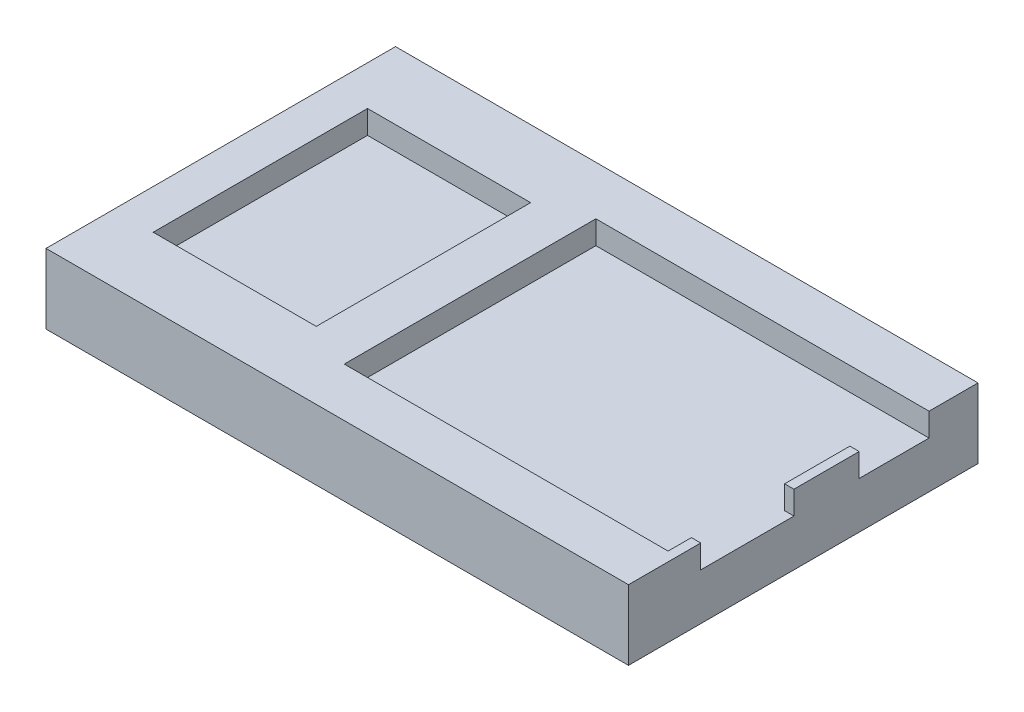
ISO-10303-21;
HEADER;
FILE_DESCRIPTION(('STEP AP214'),'2;1');
FILE_NAME('part.step','',(''),(''),'','','');
FILE_SCHEMA(('AUTOMOTIVE_DESIGN { 1 0 10303 214 1 1 1 1 }'));
ENDSEC;
DATA;
#1=APPLICATION_CONTEXT('core data for automotive mechanical design processes');
#2=APPLICATION_PROTOCOL_DEFINITION('international standard','automotive_design',2000,#1);
#3=PRODUCT_CONTEXT('',#1,'mechanical');
#4=PRODUCT('Part','Part','',(#3));
#5=PRODUCT_RELATED_PRODUCT_CATEGORY('part','',(#4));
#6=PRODUCT_DEFINITION_FORMATION('','',#4);
#7=PRODUCT_DEFINITION_CONTEXT('part definition',#1,'design');
#8=PRODUCT_DEFINITION('design','',#6,#7);
#9=PRODUCT_DEFINITION_SHAPE('','',#8);
#10=(LENGTH_UNIT() NAMED_UNIT(*) SI_UNIT(.MILLI.,.METRE.));
#11=(NAMED_UNIT(*) PLANE_ANGLE_UNIT() SI_UNIT($,.RADIAN.));
#12=(NAMED_UNIT(*) SI_UNIT($,.STERADIAN.) SOLID_ANGLE_UNIT());
#13=UNCERTAINTY_MEASURE_WITH_UNIT(LENGTH_MEASURE(1.E-05),#10,'distance_accuracy_value','');
#14=(GEOMETRIC_REPRESENTATION_CONTEXT(3) GLOBAL_UNCERTAINTY_ASSIGNED_CONTEXT((#13)) GLOBAL_UNIT_ASSIGNED_CONTEXT((#10,
#11,#12)) REPRESENTATION_CONTEXT('',''));
#15=CARTESIAN_POINT('',(0.,0.,0.));
#16=DIRECTION('',(0.,0.,1.));
#17=DIRECTION('',(1.,0.,0.));
#18=AXIS2_PLACEMENT_3D('',#15,#16,#17);
#19=CARTESIAN_POINT('',(0.,15.,0.));
#20=DIRECTION('',(0.,-1.,0.));
#21=DIRECTION('',(0.,0.,-1.));
#22=AXIS2_PLACEMENT_3D('',#19,#20,#21);
#23=PLANE('',#22);
#24=DIRECTION('',(0.,0.,-1.));
#25=VECTOR('',#24,1.);
#26=CARTESIAN_POINT('',(125.,15.,0.));
#27=LINE('',#26,#25);
#28=CARTESIAN_POINT('',(125.,15.,-35.5));
#29=VERTEX_POINT('',#28);
#30=CARTESIAN_POINT('',(125.,15.,-49.5));
#31=VERTEX_POINT('',#30);
#32=EDGE_CURVE('E465',#29,#31,#27,.T.);
#33=ORIENTED_EDGE('',*,*,#32,.T.);
#34=DIRECTION('',(1.,0.,0.));
#35=VECTOR('',#34,1.);
#36=CARTESIAN_POINT('',(125.,15.,-49.5));
#37=LINE('',#36,#35);
#38=CARTESIAN_POINT('',(123.,15.,-49.5));
#39=VERTEX_POINT('',#38);
#40=EDGE_CURVE('E370',#39,#31,#37,.T.);
#41=ORIENTED_EDGE('',*,*,#40,.F.);
#42=DIRECTION('',(0.,0.,-1.));
#43=VECTOR('',#42,1.);
#44=CARTESIAN_POINT('',(123.,15.,-49.5));
#45=LINE('',#44,#43);
#46=CARTESIAN_POINT('',(123.,15.,-35.5));
#47=VERTEX_POINT('',#46);
#48=EDGE_CURVE('E366',#47,#39,#45,.T.);
#49=ORIENTED_EDGE('',*,*,#48,.F.);
#50=DIRECTION('',(-1.,0.,0.));
#51=VECTOR('',#50,1.);
#52=CARTESIAN_POINT('',(125.,15.,-35.5));
#53=LINE('',#52,#51);
#54=EDGE_CURVE('E362',#29,#47,#53,.T.);
#55=ORIENTED_EDGE('',*,*,#54,.F.);
#56=EDGE_LOOP('',(#33,#41,#49,#55));
#57=FACE_BOUND('',#56,.T.);
#58=ADVANCED_FACE('F39',(#57),#23,.F.);
#59=CARTESIAN_POINT('',(0.,15.,0.));
#60=DIRECTION('',(1.,0.,0.));
#61=DIRECTION('',(0.,0.,-1.));
#62=AXIS2_PLACEMENT_3D('',#59,#60,#61);
#63=PLANE('',#62);
#64=DIRECTION('',(0.,0.,1.));
#65=VECTOR('',#64,1.);
#66=CARTESIAN_POINT('',(0.,0.,0.));
#67=LINE('',#66,#65);
#68=CARTESIAN_POINT('',(0.,0.,-75.));
#69=VERTEX_POINT('',#68);
#70=CARTESIAN_POINT('',(0.,0.,0.));
#71=VERTEX_POINT('',#70);
#72=EDGE_CURVE('E379',#69,#71,#67,.T.);
#73=ORIENTED_EDGE('',*,*,#72,.T.);
#74=DIRECTION('',(0.,-1.,0.));
#75=VECTOR('',#74,1.);
#76=CARTESIAN_POINT('',(0.,15.,0.));
#77=LINE('',#76,#75);
#78=CARTESIAN_POINT('',(0.,15.,0.));
#79=VERTEX_POINT('',#78);
#80=EDGE_CURVE('E11',#79,#71,#77,.T.);
#81=ORIENTED_EDGE('',*,*,#80,.F.);
#82=DIRECTION('',(0.,0.,1.));
#83=VECTOR('',#82,1.);
#84=CARTESIAN_POINT('',(0.,15.,0.));
#85=LINE('',#84,#83);
#86=CARTESIAN_POINT('',(0.,15.,-75.));
#87=VERTEX_POINT('',#86);
#88=EDGE_CURVE('E451',#87,#79,#85,.T.);
#89=ORIENTED_EDGE('',*,*,#88,.F.);
#90=DIRECTION('',(0.,-1.,0.));
#91=VECTOR('',#90,1.);
#92=CARTESIAN_POINT('',(0.,15.,-75.));
#93=LINE('',#92,#91);
#94=EDGE_CURVE('E468',#87,#69,#93,.T.);
#95=ORIENTED_EDGE('',*,*,#94,.T.);
#96=EDGE_LOOP('',(#73,#81,#89,#95));
#97=FACE_BOUND('',#96,.T.);
#98=ADVANCED_FACE('F41',(#97),#63,.F.);
#99=CARTESIAN_POINT('',(0.,15.,0.));
#100=DIRECTION('',(0.,0.,-1.));
#101=DIRECTION('',(-1.,0.,0.));
#102=AXIS2_PLACEMENT_3D('',#99,#100,#101);
#103=PLANE('',#102);
#104=DIRECTION('',(1.,0.,0.));
#105=VECTOR('',#104,1.);
#106=CARTESIAN_POINT('',(0.,0.,0.));
#107=LINE('',#106,#105);
#108=CARTESIAN_POINT('',(125.,0.,0.));
#109=VERTEX_POINT('',#108);
#110=EDGE_CURVE('E472',#71,#109,#107,.T.);
#111=ORIENTED_EDGE('',*,*,#110,.T.);
#112=DIRECTION('',(0.,-1.,0.));
#113=VECTOR('',#112,1.);
#114=CARTESIAN_POINT('',(125.,15.,0.));
#115=LINE('',#114,#113);
#116=CARTESIAN_POINT('',(125.,15.,0.));
#117=VERTEX_POINT('',#116);
#118=EDGE_CURVE('E48',#117,#109,#115,.T.);
#119=ORIENTED_EDGE('',*,*,#118,.F.);
#120=DIRECTION('',(1.,0.,0.));
#121=VECTOR('',#120,1.);
#122=CARTESIAN_POINT('',(0.,15.,0.));
#123=LINE('',#122,#121);
#124=EDGE_CURVE('E455',#79,#117,#123,.T.);
#125=ORIENTED_EDGE('',*,*,#124,.F.);
#126=ORIENTED_EDGE('',*,*,#80,.T.);
#127=EDGE_LOOP('',(#111,#119,#125,#126));
#128=FACE_BOUND('',#127,.T.);
#129=ADVANCED_FACE('F566',(#128),#103,.F.);
#130=CARTESIAN_POINT('',(125.,15.,0.));
#131=DIRECTION('',(-1.,0.,0.));
#132=DIRECTION('',(0.,0.,1.));
#133=AXIS2_PLACEMENT_3D('',#130,#131,#132);
#134=PLANE('',#133);
#135=ORIENTED_EDGE('',*,*,#32,.F.);
#136=DIRECTION('',(0.,1.,0.));
#137=VECTOR('',#136,1.);
#138=CARTESIAN_POINT('',(125.,10.,-35.5));
#139=LINE('',#138,#137);
#140=CARTESIAN_POINT('',(125.,10.,-35.5));
#141=VERTEX_POINT('',#140);
#142=EDGE_CURVE('E393',#141,#29,#139,.T.);
#143=ORIENTED_EDGE('',*,*,#142,.F.);
#144=DIRECTION('',(0.,0.,-1.));
#145=VECTOR('',#144,1.);
#146=CARTESIAN_POINT('',(125.,10.,-15.5));
#147=LINE('',#146,#145);
#148=CARTESIAN_POINT('',(125.,10.,-15.5));
#149=VERTEX_POINT('',#148);
#150=EDGE_CURVE('E323',#149,#141,#147,.T.);
#151=ORIENTED_EDGE('',*,*,#150,.F.);
#152=DIRECTION('',(0.,1.,0.));
#153=VECTOR('',#152,1.);
#154=CARTESIAN_POINT('',(125.,10.,-15.5));
#155=LINE('',#154,#153);
#156=CARTESIAN_POINT('',(125.,15.,-15.5));
#157=VERTEX_POINT('',#156);
#158=EDGE_CURVE('E396',#149,#157,#155,.T.);
#159=ORIENTED_EDGE('',*,*,#158,.T.);
#160=EDGE_CURVE('E460',#117,#157,#27,.T.);
#161=ORIENTED_EDGE('',*,*,#160,.F.);
#162=ORIENTED_EDGE('',*,*,#118,.T.);
#163=DIRECTION('',(0.,0.,-1.));
#164=VECTOR('',#163,1.);
#165=CARTESIAN_POINT('',(125.,0.,0.));
#166=LINE('',#165,#164);
#167=CARTESIAN_POINT('',(125.,0.,-75.));
#168=VERTEX_POINT('',#167);
#169=EDGE_CURVE('E475',#109,#168,#166,.T.);
#170=ORIENTED_EDGE('',*,*,#169,.T.);
#171=DIRECTION('',(0.,-1.,0.));
#172=VECTOR('',#171,1.);
#173=CARTESIAN_POINT('',(125.,15.,-75.));
#174=LINE('',#173,#172);
#175=CARTESIAN_POINT('',(125.,15.,-75.));
#176=VERTEX_POINT('',#175);
#177=EDGE_CURVE('E483',#176,#168,#174,.T.);
#178=ORIENTED_EDGE('',*,*,#177,.F.);
#179=CARTESIAN_POINT('',(125.,15.,-64.5));
#180=VERTEX_POINT('',#179);
#181=EDGE_CURVE('E459',#180,#176,#27,.T.);
#182=ORIENTED_EDGE('',*,*,#181,.F.);
#183=DIRECTION('',(0.,1.,0.));
#184=VECTOR('',#183,1.);
#185=CARTESIAN_POINT('',(125.,10.,-64.5));
#186=LINE('',#185,#184);
#187=CARTESIAN_POINT('',(125.,10.,-64.5));
#188=VERTEX_POINT('',#187);
#189=EDGE_CURVE('E380',#188,#180,#186,.T.);
#190=ORIENTED_EDGE('',*,*,#189,.F.);
#191=DIRECTION('',(0.,0.,-1.));
#192=VECTOR('',#191,1.);
#193=CARTESIAN_POINT('',(125.,10.,-64.5));
#194=LINE('',#193,#192);
#195=CARTESIAN_POINT('',(125.,10.,-49.5));
#196=VERTEX_POINT('',#195);
#197=EDGE_CURVE('E339',#196,#188,#194,.T.);
#198=ORIENTED_EDGE('',*,*,#197,.F.);
#199=DIRECTION('',(0.,1.,0.));
#200=VECTOR('',#199,1.);
#201=CARTESIAN_POINT('',(125.,10.,-49.5));
#202=LINE('',#201,#200);
#203=EDGE_CURVE('E383',#196,#31,#202,.T.);
#204=ORIENTED_EDGE('',*,*,#203,.T.);
#205=EDGE_LOOP('',(#135,#143,#151,#159,#161,#162,#170,#178,#182,#190,#198,#204));
#206=FACE_BOUND('',#205,.T.);
#207=ADVANCED_FACE('F493',(#206),#134,.F.);
#208=CARTESIAN_POINT('',(0.,15.,-75.));
#209=DIRECTION('',(0.,0.,1.));
#210=DIRECTION('',(1.,0.,0.));
#211=AXIS2_PLACEMENT_3D('',#208,#209,#210);
#212=PLANE('',#211);
#213=DIRECTION('',(-1.,0.,0.));
#214=VECTOR('',#213,1.);
#215=CARTESIAN_POINT('',(0.,0.,-75.));
#216=LINE('',#215,#214);
#217=EDGE_CURVE('E456',#168,#69,#216,.T.);
#218=ORIENTED_EDGE('',*,*,#217,.T.);
#219=ORIENTED_EDGE('',*,*,#94,.F.);
#220=DIRECTION('',(-1.,0.,0.));
#221=VECTOR('',#220,1.);
#222=CARTESIAN_POINT('',(0.,15.,-75.));
#223=LINE('',#222,#221);
#224=EDGE_CURVE('E464',#176,#87,#223,.T.);
#225=ORIENTED_EDGE('',*,*,#224,.F.);
#226=ORIENTED_EDGE('',*,*,#177,.T.);
#227=EDGE_LOOP('',(#218,#219,#225,#226));
#228=FACE_BOUND('',#227,.T.);
#229=ADVANCED_FACE('F502',(#228),#212,.F.);
#230=DIRECTION('',(1.,0.,0.));
#231=VECTOR('',#230,1.);
#232=CARTESIAN_POINT('',(8.49999999999997,15.,-14.5));
#233=LINE('',#232,#231);
#234=CARTESIAN_POINT('',(8.49999999999997,15.,-14.5));
#235=VERTEX_POINT('',#234);
#236=CARTESIAN_POINT('',(43.5,15.,-14.5));
#237=VERTEX_POINT('',#236);
#238=EDGE_CURVE('E429',#235,#237,#233,.T.);
#239=ORIENTED_EDGE('',*,*,#238,.F.);
#240=DIRECTION('',(0.,0.,1.));
#241=VECTOR('',#240,1.);
#242=CARTESIAN_POINT('',(8.49999999999997,15.,-60.5));
#243=LINE('',#242,#241);
#244=CARTESIAN_POINT('',(8.49999999999997,15.,-60.5));
#245=VERTEX_POINT('',#244);
#246=EDGE_CURVE('E259',#245,#235,#243,.T.);
#247=ORIENTED_EDGE('',*,*,#246,.F.);
#248=DIRECTION('',(-1.,0.,0.));
#249=VECTOR('',#248,1.);
#250=CARTESIAN_POINT('',(8.49999999999997,15.,-60.5));
#251=LINE('',#250,#249);
#252=CARTESIAN_POINT('',(43.5,15.,-60.5));
#253=VERTEX_POINT('',#252);
#254=EDGE_CURVE('E414',#253,#245,#251,.T.);
#255=ORIENTED_EDGE('',*,*,#254,.F.);
#256=DIRECTION('',(0.,0.,-1.));
#257=VECTOR('',#256,1.);
#258=CARTESIAN_POINT('',(43.5,15.,-60.5));
#259=LINE('',#258,#257);
#260=EDGE_CURVE('E433',#237,#253,#259,.T.);
#261=ORIENTED_EDGE('',*,*,#260,.F.);
#262=EDGE_LOOP('',(#239,#247,#255,#261));
#263=FACE_BOUND('',#262,.T.);
#264=DIRECTION('',(0.,0.,1.));
#265=VECTOR('',#264,1.);
#266=CARTESIAN_POINT('',(53.5,15.,-64.5));
#267=LINE('',#266,#265);
#268=CARTESIAN_POINT('',(53.5,15.,-64.5));
#269=VERTEX_POINT('',#268);
#270=CARTESIAN_POINT('',(53.5,15.,-10.5));
#271=VERTEX_POINT('',#270);
#272=EDGE_CURVE('E347',#269,#271,#267,.T.);
#273=ORIENTED_EDGE('',*,*,#272,.F.);
#274=DIRECTION('',(-1.,0.,0.));
#275=VECTOR('',#274,1.);
#276=CARTESIAN_POINT('',(53.5,15.,-64.5));
#277=LINE('',#276,#275);
#278=EDGE_CURVE('E311',#180,#269,#277,.T.);
#279=ORIENTED_EDGE('',*,*,#278,.F.);
#280=ORIENTED_EDGE('',*,*,#181,.T.);
#281=ORIENTED_EDGE('',*,*,#224,.T.);
#282=ORIENTED_EDGE('',*,*,#88,.T.);
#283=ORIENTED_EDGE('',*,*,#124,.T.);
#284=ORIENTED_EDGE('',*,*,#160,.T.);
#285=DIRECTION('',(1.,0.,0.));
#286=VECTOR('',#285,1.);
#287=CARTESIAN_POINT('',(125.,15.,-15.5));
#288=LINE('',#287,#286);
#289=CARTESIAN_POINT('',(123.,15.,-15.5));
#290=VERTEX_POINT('',#289);
#291=EDGE_CURVE('E359',#290,#157,#288,.T.);
#292=ORIENTED_EDGE('',*,*,#291,.F.);
#293=DIRECTION('',(0.,0.,-1.));
#294=VECTOR('',#293,1.);
#295=CARTESIAN_POINT('',(123.,15.,-15.5));
#296=LINE('',#295,#294);
#297=CARTESIAN_POINT('',(123.,15.,-10.5));
#298=VERTEX_POINT('',#297);
#299=EDGE_CURVE('E355',#298,#290,#296,.T.);
#300=ORIENTED_EDGE('',*,*,#299,.F.);
#301=DIRECTION('',(1.,0.,0.));
#302=VECTOR('',#301,1.);
#303=CARTESIAN_POINT('',(53.5,15.,-10.5));
#304=LINE('',#303,#302);
#305=EDGE_CURVE('E350',#271,#298,#304,.T.);
#306=ORIENTED_EDGE('',*,*,#305,.F.);
#307=EDGE_LOOP('',(#273,#279,#280,#281,#282,#283,#284,#292,#300,#306));
#308=FACE_BOUND('',#307,.T.);
#309=ADVANCED_FACE('F509',(#263,#308),#23,.F.);
#310=CARTESIAN_POINT('',(0.,0.,0.));
#311=DIRECTION('',(0.,-1.,0.));
#312=DIRECTION('',(0.,0.,-1.));
#313=AXIS2_PLACEMENT_3D('',#310,#311,#312);
#314=PLANE('',#313);
#315=DIRECTION('',(0.,0.,1.));
#316=VECTOR('',#315,1.);
#317=CARTESIAN_POINT('',(20.6,0.,-52.5));
#318=LINE('',#317,#316);
#319=CARTESIAN_POINT('',(20.6,0.,-52.5));
#320=VERTEX_POINT('',#319);
#321=CARTESIAN_POINT('',(20.6,0.,-22.5));
#322=VERTEX_POINT('',#321);
#323=EDGE_CURVE('E55',#320,#322,#318,.T.);
#324=ORIENTED_EDGE('',*,*,#323,.F.);
#325=DIRECTION('',(1.,0.,0.));
#326=VECTOR('',#325,1.);
#327=CARTESIAN_POINT('',(20.6,0.,-52.5));
#328=LINE('',#327,#326);
#329=CARTESIAN_POINT('',(15.,0.,-52.5));
#330=VERTEX_POINT('',#329);
#331=EDGE_CURVE('E236',#330,#320,#328,.T.);
#332=ORIENTED_EDGE('',*,*,#331,.F.);
#333=DIRECTION('',(0.,0.,-1.));
#334=VECTOR('',#333,1.);
#335=CARTESIAN_POINT('',(15.,0.,-52.5));
#336=LINE('',#335,#334);
#337=CARTESIAN_POINT('',(15.,0.,-22.5));
#338=VERTEX_POINT('',#337);
#339=EDGE_CURVE('E240',#338,#330,#336,.T.);
#340=ORIENTED_EDGE('',*,*,#339,.F.);
#341=DIRECTION('',(-1.,0.,0.));
#342=VECTOR('',#341,1.);
#343=CARTESIAN_POINT('',(20.6,0.,-22.5));
#344=LINE('',#343,#342);
#345=EDGE_CURVE('E249',#322,#338,#344,.T.);
#346=ORIENTED_EDGE('',*,*,#345,.F.);
#347=EDGE_LOOP('',(#324,#332,#340,#346));
#348=FACE_BOUND('',#347,.T.);
#349=DIRECTION('',(0.,0.,-1.));
#350=VECTOR('',#349,1.);
#351=CARTESIAN_POINT('',(104.4,0.,-52.5));
#352=LINE('',#351,#350);
#353=CARTESIAN_POINT('',(104.4,0.,-22.5));
#354=VERTEX_POINT('',#353);
#355=CARTESIAN_POINT('',(104.4,0.,-52.5));
#356=VERTEX_POINT('',#355);
#357=EDGE_CURVE('E63',#354,#356,#352,.T.);
#358=ORIENTED_EDGE('',*,*,#357,.F.);
#359=DIRECTION('',(-1.,0.,0.));
#360=VECTOR('',#359,1.);
#361=CARTESIAN_POINT('',(104.4,0.,-22.5));
#362=LINE('',#361,#360);
#363=CARTESIAN_POINT('',(110.,0.,-22.5));
#364=VERTEX_POINT('',#363);
#365=EDGE_CURVE('E270',#364,#354,#362,.T.);
#366=ORIENTED_EDGE('',*,*,#365,.F.);
#367=DIRECTION('',(0.,0.,1.));
#368=VECTOR('',#367,1.);
#369=CARTESIAN_POINT('',(110.,0.,-52.5));
#370=LINE('',#369,#368);
#371=CARTESIAN_POINT('',(110.,0.,-52.5));
#372=VERTEX_POINT('',#371);
#373=EDGE_CURVE('E289',#372,#364,#370,.T.);
#374=ORIENTED_EDGE('',*,*,#373,.F.);
#375=DIRECTION('',(1.,0.,0.));
#376=VECTOR('',#375,1.);
#377=CARTESIAN_POINT('',(104.4,0.,-52.5));
#378=LINE('',#377,#376);
#379=EDGE_CURVE('E285',#356,#372,#378,.T.);
#380=ORIENTED_EDGE('',*,*,#379,.F.);
#381=EDGE_LOOP('',(#358,#366,#374,#380));
#382=FACE_BOUND('',#381,.T.);
#383=ORIENTED_EDGE('',*,*,#72,.F.);
#384=ORIENTED_EDGE('',*,*,#217,.F.);
#385=ORIENTED_EDGE('',*,*,#169,.F.);
#386=ORIENTED_EDGE('',*,*,#110,.F.);
#387=EDGE_LOOP('',(#383,#384,#385,#386));
#388=FACE_BOUND('',#387,.T.);
#389=ADVANCED_FACE('F499',(#348,#382,#388),#314,.T.);
#390=CARTESIAN_POINT('',(8.49999999999997,10.,-60.5));
#391=DIRECTION('',(-1.,0.,0.));
#392=DIRECTION('',(0.,0.,1.));
#393=AXIS2_PLACEMENT_3D('',#390,#391,#392);
#394=PLANE('',#393);
#395=ORIENTED_EDGE('',*,*,#246,.T.);
#396=DIRECTION('',(0.,1.,0.));
#397=VECTOR('',#396,1.);
#398=CARTESIAN_POINT('',(8.49999999999997,10.,-14.5));
#399=LINE('',#398,#397);
#400=CARTESIAN_POINT('',(8.49999999999997,10.,-14.5));
#401=VERTEX_POINT('',#400);
#402=EDGE_CURVE('E426',#401,#235,#399,.T.);
#403=ORIENTED_EDGE('',*,*,#402,.F.);
#404=DIRECTION('',(0.,0.,1.));
#405=VECTOR('',#404,1.);
#406=CARTESIAN_POINT('',(8.49999999999997,10.,-60.5));
#407=LINE('',#406,#405);
#408=CARTESIAN_POINT('',(8.49999999999997,10.,-60.5));
#409=VERTEX_POINT('',#408);
#410=EDGE_CURVE('E409',#409,#401,#407,.T.);
#411=ORIENTED_EDGE('',*,*,#410,.F.);
#412=DIRECTION('',(0.,1.,0.));
#413=VECTOR('',#412,1.);
#414=CARTESIAN_POINT('',(8.49999999999997,10.,-60.5));
#415=LINE('',#414,#413);
#416=EDGE_CURVE('E351',#409,#245,#415,.T.);
#417=ORIENTED_EDGE('',*,*,#416,.T.);
#418=EDGE_LOOP('',(#395,#403,#411,#417));
#419=FACE_BOUND('',#418,.T.);
#420=ADVANCED_FACE('F575',(#419),#394,.F.);
#421=CARTESIAN_POINT('',(8.49999999999997,10.,-60.5));
#422=DIRECTION('',(0.,0.,-1.));
#423=DIRECTION('',(-1.,0.,0.));
#424=AXIS2_PLACEMENT_3D('',#421,#422,#423);
#425=PLANE('',#424);
#426=ORIENTED_EDGE('',*,*,#254,.T.);
#427=ORIENTED_EDGE('',*,*,#416,.F.);
#428=DIRECTION('',(-1.,0.,0.));
#429=VECTOR('',#428,1.);
#430=CARTESIAN_POINT('',(8.49999999999997,10.,-60.5));
#431=LINE('',#430,#429);
#432=CARTESIAN_POINT('',(43.5,10.,-60.5));
#433=VERTEX_POINT('',#432);
#434=EDGE_CURVE('E422',#433,#409,#431,.T.);
#435=ORIENTED_EDGE('',*,*,#434,.F.);
#436=DIRECTION('',(0.,1.,0.));
#437=VECTOR('',#436,1.);
#438=CARTESIAN_POINT('',(43.5,10.,-60.5));
#439=LINE('',#438,#437);
#440=EDGE_CURVE('E442',#433,#253,#439,.T.);
#441=ORIENTED_EDGE('',*,*,#440,.T.);
#442=EDGE_LOOP('',(#426,#427,#435,#441));
#443=FACE_BOUND('',#442,.T.);
#444=ADVANCED_FACE('F590',(#443),#425,.F.);
#445=CARTESIAN_POINT('',(43.5,10.,-60.5));
#446=DIRECTION('',(1.,0.,0.));
#447=DIRECTION('',(0.,0.,-1.));
#448=AXIS2_PLACEMENT_3D('',#445,#446,#447);
#449=PLANE('',#448);
#450=ORIENTED_EDGE('',*,*,#260,.T.);
#451=ORIENTED_EDGE('',*,*,#440,.F.);
#452=DIRECTION('',(0.,0.,-1.));
#453=VECTOR('',#452,1.);
#454=CARTESIAN_POINT('',(43.5,10.,-60.5));
#455=LINE('',#454,#453);
#456=CARTESIAN_POINT('',(43.5,10.,-14.5));
#457=VERTEX_POINT('',#456);
#458=EDGE_CURVE('E418',#457,#433,#455,.T.);
#459=ORIENTED_EDGE('',*,*,#458,.F.);
#460=DIRECTION('',(0.,1.,0.));
#461=VECTOR('',#460,1.);
#462=CARTESIAN_POINT('',(43.5,10.,-14.5));
#463=LINE('',#462,#461);
#464=EDGE_CURVE('E445',#457,#237,#463,.T.);
#465=ORIENTED_EDGE('',*,*,#464,.T.);
#466=EDGE_LOOP('',(#450,#451,#459,#465));
#467=FACE_BOUND('',#466,.T.);
#468=ADVANCED_FACE('F592',(#467),#449,.F.);
#469=CARTESIAN_POINT('',(8.49999999999997,10.,-14.5));
#470=DIRECTION('',(0.,0.,1.));
#471=DIRECTION('',(1.,0.,0.));
#472=AXIS2_PLACEMENT_3D('',#469,#470,#471);
#473=PLANE('',#472);
#474=ORIENTED_EDGE('',*,*,#238,.T.);
#475=ORIENTED_EDGE('',*,*,#464,.F.);
#476=DIRECTION('',(1.,0.,0.));
#477=VECTOR('',#476,1.);
#478=CARTESIAN_POINT('',(8.49999999999997,10.,-14.5));
#479=LINE('',#478,#477);
#480=EDGE_CURVE('E413',#401,#457,#479,.T.);
#481=ORIENTED_EDGE('',*,*,#480,.F.);
#482=ORIENTED_EDGE('',*,*,#402,.T.);
#483=EDGE_LOOP('',(#474,#475,#481,#482));
#484=FACE_BOUND('',#483,.T.);
#485=ADVANCED_FACE('F583',(#484),#473,.F.);
#486=CARTESIAN_POINT('',(0.,10.,0.));
#487=DIRECTION('',(0.,1.,0.));
#488=DIRECTION('',(0.,0.,1.));
#489=AXIS2_PLACEMENT_3D('',#486,#487,#488);
#490=PLANE('',#489);
#491=ORIENTED_EDGE('',*,*,#410,.T.);
#492=ORIENTED_EDGE('',*,*,#480,.T.);
#493=ORIENTED_EDGE('',*,*,#458,.T.);
#494=ORIENTED_EDGE('',*,*,#434,.T.);
#495=EDGE_LOOP('',(#491,#492,#493,#494));
#496=FACE_BOUND('',#495,.T.);
#497=ADVANCED_FACE('F558',(#496),#490,.T.);
#498=CARTESIAN_POINT('',(53.5,10.,-64.5));
#499=DIRECTION('',(-1.,0.,0.));
#500=DIRECTION('',(0.,0.,1.));
#501=AXIS2_PLACEMENT_3D('',#498,#499,#500);
#502=PLANE('',#501);
#503=ORIENTED_EDGE('',*,*,#272,.T.);
#504=DIRECTION('',(0.,1.,0.));
#505=VECTOR('',#504,1.);
#506=CARTESIAN_POINT('',(53.5,10.,-10.5));
#507=LINE('',#506,#505);
#508=CARTESIAN_POINT('',(53.5,10.,-10.5));
#509=VERTEX_POINT('',#508);
#510=EDGE_CURVE('E346',#509,#271,#507,.T.);
#511=ORIENTED_EDGE('',*,*,#510,.F.);
#512=DIRECTION('',(0.,0.,1.));
#513=VECTOR('',#512,1.);
#514=CARTESIAN_POINT('',(53.5,10.,-64.5));
#515=LINE('',#514,#513);
#516=CARTESIAN_POINT('',(53.5,10.,-64.5));
#517=VERTEX_POINT('',#516);
#518=EDGE_CURVE('E306',#517,#509,#515,.T.);
#519=ORIENTED_EDGE('',*,*,#518,.F.);
#520=DIRECTION('',(0.,1.,0.));
#521=VECTOR('',#520,1.);
#522=CARTESIAN_POINT('',(53.5,10.,-64.5));
#523=LINE('',#522,#521);
#524=EDGE_CURVE('E376',#517,#269,#523,.T.);
#525=ORIENTED_EDGE('',*,*,#524,.T.);
#526=EDGE_LOOP('',(#503,#511,#519,#525));
#527=FACE_BOUND('',#526,.T.);
#528=ADVANCED_FACE('F547',(#527),#502,.F.);
#529=CARTESIAN_POINT('',(53.5,10.,-64.5));
#530=DIRECTION('',(0.,0.,-1.));
#531=DIRECTION('',(-1.,0.,0.));
#532=AXIS2_PLACEMENT_3D('',#529,#530,#531);
#533=PLANE('',#532);
#534=ORIENTED_EDGE('',*,*,#278,.T.);
#535=ORIENTED_EDGE('',*,*,#524,.F.);
#536=DIRECTION('',(-1.,0.,0.));
#537=VECTOR('',#536,1.);
#538=CARTESIAN_POINT('',(53.5,10.,-64.5));
#539=LINE('',#538,#537);
#540=EDGE_CURVE('E342',#188,#517,#539,.T.);
#541=ORIENTED_EDGE('',*,*,#540,.F.);
#542=ORIENTED_EDGE('',*,*,#189,.T.);
#543=EDGE_LOOP('',(#534,#535,#541,#542));
#544=FACE_BOUND('',#543,.T.);
#545=ADVANCED_FACE('F550',(#544),#533,.F.);
#546=CARTESIAN_POINT('',(125.,10.,-49.5));
#547=DIRECTION('',(0.,0.,1.));
#548=DIRECTION('',(1.,0.,0.));
#549=AXIS2_PLACEMENT_3D('',#546,#547,#548);
#550=PLANE('',#549);
#551=ORIENTED_EDGE('',*,*,#40,.T.);
#552=ORIENTED_EDGE('',*,*,#203,.F.);
#553=DIRECTION('',(1.,0.,0.));
#554=VECTOR('',#553,1.);
#555=CARTESIAN_POINT('',(125.,10.,-49.5));
#556=LINE('',#555,#554);
#557=CARTESIAN_POINT('',(123.,10.,-49.5));
#558=VERTEX_POINT('',#557);
#559=EDGE_CURVE('E335',#558,#196,#556,.T.);
#560=ORIENTED_EDGE('',*,*,#559,.F.);
#561=DIRECTION('',(0.,1.,0.));
#562=VECTOR('',#561,1.);
#563=CARTESIAN_POINT('',(123.,10.,-49.5));
#564=LINE('',#563,#562);
#565=EDGE_CURVE('E387',#558,#39,#564,.T.);
#566=ORIENTED_EDGE('',*,*,#565,.T.);
#567=EDGE_LOOP('',(#551,#552,#560,#566));
#568=FACE_BOUND('',#567,.T.);
#569=ADVANCED_FACE('F525',(#568),#550,.F.);
#570=CARTESIAN_POINT('',(123.,10.,-49.5));
#571=DIRECTION('',(1.,0.,0.));
#572=DIRECTION('',(0.,0.,-1.));
#573=AXIS2_PLACEMENT_3D('',#570,#571,#572);
#574=PLANE('',#573);
#575=ORIENTED_EDGE('',*,*,#48,.T.);
#576=ORIENTED_EDGE('',*,*,#565,.F.);
#577=DIRECTION('',(0.,0.,-1.));
#578=VECTOR('',#577,1.);
#579=CARTESIAN_POINT('',(123.,10.,-49.5));
#580=LINE('',#579,#578);
#581=CARTESIAN_POINT('',(123.,10.,-35.5));
#582=VERTEX_POINT('',#581);
#583=EDGE_CURVE('E331',#582,#558,#580,.T.);
#584=ORIENTED_EDGE('',*,*,#583,.F.);
#585=DIRECTION('',(0.,1.,0.));
#586=VECTOR('',#585,1.);
#587=CARTESIAN_POINT('',(123.,10.,-35.5));
#588=LINE('',#587,#586);
#589=EDGE_CURVE('E390',#582,#47,#588,.T.);
#590=ORIENTED_EDGE('',*,*,#589,.T.);
#591=EDGE_LOOP('',(#575,#576,#584,#590));
#592=FACE_BOUND('',#591,.T.);
#593=ADVANCED_FACE('F531',(#592),#574,.F.);
#594=CARTESIAN_POINT('',(125.,10.,-35.5));
#595=DIRECTION('',(0.,0.,-1.));
#596=DIRECTION('',(-1.,0.,0.));
#597=AXIS2_PLACEMENT_3D('',#594,#595,#596);
#598=PLANE('',#597);
#599=ORIENTED_EDGE('',*,*,#54,.T.);
#600=ORIENTED_EDGE('',*,*,#589,.F.);
#601=DIRECTION('',(-1.,0.,0.));
#602=VECTOR('',#601,1.);
#603=CARTESIAN_POINT('',(125.,10.,-35.5));
#604=LINE('',#603,#602);
#605=EDGE_CURVE('E327',#141,#582,#604,.T.);
#606=ORIENTED_EDGE('',*,*,#605,.F.);
#607=ORIENTED_EDGE('',*,*,#142,.T.);
#608=EDGE_LOOP('',(#599,#600,#606,#607));
#609=FACE_BOUND('',#608,.T.);
#610=ADVANCED_FACE('F533',(#609),#598,.F.);
#611=CARTESIAN_POINT('',(125.,10.,-15.5));
#612=DIRECTION('',(0.,0.,1.));
#613=DIRECTION('',(1.,0.,0.));
#614=AXIS2_PLACEMENT_3D('',#611,#612,#613);
#615=PLANE('',#614);
#616=ORIENTED_EDGE('',*,*,#291,.T.);
#617=ORIENTED_EDGE('',*,*,#158,.F.);
#618=DIRECTION('',(1.,0.,0.));
#619=VECTOR('',#618,1.);
#620=CARTESIAN_POINT('',(125.,10.,-15.5));
#621=LINE('',#620,#619);
#622=CARTESIAN_POINT('',(123.,10.,-15.5));
#623=VERTEX_POINT('',#622);
#624=EDGE_CURVE('E319',#623,#149,#621,.T.);
#625=ORIENTED_EDGE('',*,*,#624,.F.);
#626=DIRECTION('',(0.,1.,0.));
#627=VECTOR('',#626,1.);
#628=CARTESIAN_POINT('',(123.,10.,-15.5));
#629=LINE('',#628,#627);
#630=EDGE_CURVE('E400',#623,#290,#629,.T.);
#631=ORIENTED_EDGE('',*,*,#630,.T.);
#632=EDGE_LOOP('',(#616,#617,#625,#631));
#633=FACE_BOUND('',#632,.T.);
#634=ADVANCED_FACE('F539',(#633),#615,.F.);
#635=CARTESIAN_POINT('',(123.,10.,-15.5));
#636=DIRECTION('',(1.,0.,0.));
#637=DIRECTION('',(0.,0.,-1.));
#638=AXIS2_PLACEMENT_3D('',#635,#636,#637);
#639=PLANE('',#638);
#640=ORIENTED_EDGE('',*,*,#299,.T.);
#641=ORIENTED_EDGE('',*,*,#630,.F.);
#642=DIRECTION('',(0.,0.,-1.));
#643=VECTOR('',#642,1.);
#644=CARTESIAN_POINT('',(123.,10.,-15.5));
#645=LINE('',#644,#643);
#646=CARTESIAN_POINT('',(123.,10.,-10.5));
#647=VERTEX_POINT('',#646);
#648=EDGE_CURVE('E315',#647,#623,#645,.T.);
#649=ORIENTED_EDGE('',*,*,#648,.F.);
#650=DIRECTION('',(0.,1.,0.));
#651=VECTOR('',#650,1.);
#652=CARTESIAN_POINT('',(123.,10.,-10.5));
#653=LINE('',#652,#651);
#654=EDGE_CURVE('E403',#647,#298,#653,.T.);
#655=ORIENTED_EDGE('',*,*,#654,.T.);
#656=EDGE_LOOP('',(#640,#641,#649,#655));
#657=FACE_BOUND('',#656,.T.);
#658=ADVANCED_FACE('F542',(#657),#639,.F.);
#659=CARTESIAN_POINT('',(53.5,10.,-10.5));
#660=DIRECTION('',(0.,0.,1.));
#661=DIRECTION('',(1.,0.,0.));
#662=AXIS2_PLACEMENT_3D('',#659,#660,#661);
#663=PLANE('',#662);
#664=ORIENTED_EDGE('',*,*,#305,.T.);
#665=ORIENTED_EDGE('',*,*,#654,.F.);
#666=DIRECTION('',(1.,0.,0.));
#667=VECTOR('',#666,1.);
#668=CARTESIAN_POINT('',(53.5,10.,-10.5));
#669=LINE('',#668,#667);
#670=EDGE_CURVE('E310',#509,#647,#669,.T.);
#671=ORIENTED_EDGE('',*,*,#670,.F.);
#672=ORIENTED_EDGE('',*,*,#510,.T.);
#673=EDGE_LOOP('',(#664,#665,#671,#672));
#674=FACE_BOUND('',#673,.T.);
#675=ADVANCED_FACE('F545',(#674),#663,.F.);
#676=CARTESIAN_POINT('',(0.,10.,0.));
#677=DIRECTION('',(0.,1.,0.));
#678=DIRECTION('',(0.,0.,1.));
#679=AXIS2_PLACEMENT_3D('',#676,#677,#678);
#680=PLANE('',#679);
#681=ORIENTED_EDGE('',*,*,#518,.T.);
#682=ORIENTED_EDGE('',*,*,#670,.T.);
#683=ORIENTED_EDGE('',*,*,#648,.T.);
#684=ORIENTED_EDGE('',*,*,#624,.T.);
#685=ORIENTED_EDGE('',*,*,#150,.T.);
#686=ORIENTED_EDGE('',*,*,#605,.T.);
#687=ORIENTED_EDGE('',*,*,#583,.T.);
#688=ORIENTED_EDGE('',*,*,#559,.T.);
#689=ORIENTED_EDGE('',*,*,#197,.T.);
#690=ORIENTED_EDGE('',*,*,#540,.T.);
#691=EDGE_LOOP('',(#681,#682,#683,#684,#685,#686,#687,#688,#689,#690));
#692=FACE_BOUND('',#691,.T.);
#693=ADVANCED_FACE('F527',(#692),#680,.T.);
#694=CARTESIAN_POINT('',(104.4,5.,-52.5));
#695=DIRECTION('',(-1.,0.,0.));
#696=DIRECTION('',(0.,0.,1.));
#697=AXIS2_PLACEMENT_3D('',#694,#695,#696);
#698=PLANE('',#697);
#699=ORIENTED_EDGE('',*,*,#357,.T.);
#700=DIRECTION('',(0.,-1.,0.));
#701=VECTOR('',#700,1.);
#702=CARTESIAN_POINT('',(104.4,5.,-52.5));
#703=LINE('',#702,#701);
#704=CARTESIAN_POINT('',(104.4,5.,-52.5));
#705=VERTEX_POINT('',#704);
#706=EDGE_CURVE('E282',#705,#356,#703,.T.);
#707=ORIENTED_EDGE('',*,*,#706,.F.);
#708=DIRECTION('',(0.,0.,-1.));
#709=VECTOR('',#708,1.);
#710=CARTESIAN_POINT('',(104.4,5.,-52.5));
#711=LINE('',#710,#709);
#712=CARTESIAN_POINT('',(104.4,5.,-22.5));
#713=VERTEX_POINT('',#712);
#714=EDGE_CURVE('E265',#713,#705,#711,.T.);
#715=ORIENTED_EDGE('',*,*,#714,.F.);
#716=DIRECTION('',(0.,-1.,0.));
#717=VECTOR('',#716,1.);
#718=CARTESIAN_POINT('',(104.4,5.,-22.5));
#719=LINE('',#718,#717);
#720=EDGE_CURVE('E250',#713,#354,#719,.T.);
#721=ORIENTED_EDGE('',*,*,#720,.T.);
#722=EDGE_LOOP('',(#699,#707,#715,#721));
#723=FACE_BOUND('',#722,.T.);
#724=ADVANCED_FACE('F689',(#723),#698,.F.);
#725=CARTESIAN_POINT('',(104.4,5.,-22.5));
#726=DIRECTION('',(0.,0.,1.));
#727=DIRECTION('',(1.,0.,0.));
#728=AXIS2_PLACEMENT_3D('',#725,#726,#727);
#729=PLANE('',#728);
#730=ORIENTED_EDGE('',*,*,#365,.T.);
#731=ORIENTED_EDGE('',*,*,#720,.F.);
#732=DIRECTION('',(-1.,0.,0.));
#733=VECTOR('',#732,1.);
#734=CARTESIAN_POINT('',(104.4,5.,-22.5));
#735=LINE('',#734,#733);
#736=CARTESIAN_POINT('',(110.,5.,-22.5));
#737=VERTEX_POINT('',#736);
#738=EDGE_CURVE('E278',#737,#713,#735,.T.);
#739=ORIENTED_EDGE('',*,*,#738,.F.);
#740=DIRECTION('',(0.,-1.,0.));
#741=VECTOR('',#740,1.);
#742=CARTESIAN_POINT('',(110.,5.,-22.5));
#743=LINE('',#742,#741);
#744=EDGE_CURVE('E298',#737,#364,#743,.T.);
#745=ORIENTED_EDGE('',*,*,#744,.T.);
#746=EDGE_LOOP('',(#730,#731,#739,#745));
#747=FACE_BOUND('',#746,.T.);
#748=ADVANCED_FACE('F704',(#747),#729,.F.);
#749=CARTESIAN_POINT('',(110.,5.,-52.5));
#750=DIRECTION('',(1.,0.,0.));
#751=DIRECTION('',(0.,0.,-1.));
#752=AXIS2_PLACEMENT_3D('',#749,#750,#751);
#753=PLANE('',#752);
#754=ORIENTED_EDGE('',*,*,#373,.T.);
#755=ORIENTED_EDGE('',*,*,#744,.F.);
#756=DIRECTION('',(0.,0.,1.));
#757=VECTOR('',#756,1.);
#758=CARTESIAN_POINT('',(110.,5.,-52.5));
#759=LINE('',#758,#757);
#760=CARTESIAN_POINT('',(110.,5.,-52.5));
#761=VERTEX_POINT('',#760);
#762=EDGE_CURVE('E274',#761,#737,#759,.T.);
#763=ORIENTED_EDGE('',*,*,#762,.F.);
#764=DIRECTION('',(0.,-1.,0.));
#765=VECTOR('',#764,1.);
#766=CARTESIAN_POINT('',(110.,5.,-52.5));
#767=LINE('',#766,#765);
#768=EDGE_CURVE('E301',#761,#372,#767,.T.);
#769=ORIENTED_EDGE('',*,*,#768,.T.);
#770=EDGE_LOOP('',(#754,#755,#763,#769));
#771=FACE_BOUND('',#770,.T.);
#772=ADVANCED_FACE('F713',(#771),#753,.F.);
#773=CARTESIAN_POINT('',(104.4,5.,-52.5));
#774=DIRECTION('',(0.,0.,-1.));
#775=DIRECTION('',(-1.,0.,0.));
#776=AXIS2_PLACEMENT_3D('',#773,#774,#775);
#777=PLANE('',#776);
#778=ORIENTED_EDGE('',*,*,#379,.T.);
#779=ORIENTED_EDGE('',*,*,#768,.F.);
#780=DIRECTION('',(1.,0.,0.));
#781=VECTOR('',#780,1.);
#782=CARTESIAN_POINT('',(104.4,5.,-52.5));
#783=LINE('',#782,#781);
#784=EDGE_CURVE('E269',#705,#761,#783,.T.);
#785=ORIENTED_EDGE('',*,*,#784,.F.);
#786=ORIENTED_EDGE('',*,*,#706,.T.);
#787=EDGE_LOOP('',(#778,#779,#785,#786));
#788=FACE_BOUND('',#787,.T.);
#789=ADVANCED_FACE('F723',(#788),#777,.F.);
#790=CARTESIAN_POINT('',(0.,5.,0.));
#791=DIRECTION('',(0.,1.,0.));
#792=DIRECTION('',(0.,0.,1.));
#793=AXIS2_PLACEMENT_3D('',#790,#791,#792);
#794=PLANE('',#793);
#795=ORIENTED_EDGE('',*,*,#714,.T.);
#796=ORIENTED_EDGE('',*,*,#784,.T.);
#797=ORIENTED_EDGE('',*,*,#762,.T.);
#798=ORIENTED_EDGE('',*,*,#738,.T.);
#799=EDGE_LOOP('',(#795,#796,#797,#798));
#800=FACE_BOUND('',#799,.T.);
#801=ADVANCED_FACE('F733',(#800),#794,.F.);
#802=CARTESIAN_POINT('',(20.6,5.,-52.5));
#803=DIRECTION('',(1.,0.,0.));
#804=DIRECTION('',(0.,0.,-1.));
#805=AXIS2_PLACEMENT_3D('',#802,#803,#804);
#806=PLANE('',#805);
#807=ORIENTED_EDGE('',*,*,#323,.T.);
#808=DIRECTION('',(0.,-1.,0.));
#809=VECTOR('',#808,1.);
#810=CARTESIAN_POINT('',(20.6,5.,-22.5));
#811=LINE('',#810,#809);
#812=CARTESIAN_POINT('',(20.6,5.,-22.5));
#813=VERTEX_POINT('',#812);
#814=EDGE_CURVE('E211',#813,#322,#811,.T.);
#815=ORIENTED_EDGE('',*,*,#814,.F.);
#816=DIRECTION('',(0.,0.,1.));
#817=VECTOR('',#816,1.);
#818=CARTESIAN_POINT('',(20.6,5.,-52.5));
#819=LINE('',#818,#817);
#820=CARTESIAN_POINT('',(20.6,5.,-52.5));
#821=VERTEX_POINT('',#820);
#822=EDGE_CURVE('E215',#821,#813,#819,.T.);
#823=ORIENTED_EDGE('',*,*,#822,.F.);
#824=DIRECTION('',(0.,-1.,0.));
#825=VECTOR('',#824,1.);
#826=CARTESIAN_POINT('',(20.6,5.,-52.5));
#827=LINE('',#826,#825);
#828=EDGE_CURVE('E256',#821,#320,#827,.T.);
#829=ORIENTED_EDGE('',*,*,#828,.T.);
#830=EDGE_LOOP('',(#807,#815,#823,#829));
#831=FACE_BOUND('',#830,.T.);
#832=ADVANCED_FACE('F213',(#831),#806,.F.);
#833=CARTESIAN_POINT('',(20.6,5.,-52.5));
#834=DIRECTION('',(0.,0.,-1.));
#835=DIRECTION('',(-1.,0.,0.));
#836=AXIS2_PLACEMENT_3D('',#833,#834,#835);
#837=PLANE('',#836);
#838=ORIENTED_EDGE('',*,*,#331,.T.);
#839=ORIENTED_EDGE('',*,*,#828,.F.);
#840=DIRECTION('',(1.,0.,0.));
#841=VECTOR('',#840,1.);
#842=CARTESIAN_POINT('',(20.6,5.,-52.5));
#843=LINE('',#842,#841);
#844=CARTESIAN_POINT('',(15.,5.,-52.5));
#845=VERTEX_POINT('',#844);
#846=EDGE_CURVE('E222',#845,#821,#843,.T.);
#847=ORIENTED_EDGE('',*,*,#846,.F.);
#848=DIRECTION('',(0.,-1.,0.));
#849=VECTOR('',#848,1.);
#850=CARTESIAN_POINT('',(15.,5.,-52.5));
#851=LINE('',#850,#849);
#852=EDGE_CURVE('E260',#845,#330,#851,.T.);
#853=ORIENTED_EDGE('',*,*,#852,.T.);
#854=EDGE_LOOP('',(#838,#839,#847,#853));
#855=FACE_BOUND('',#854,.T.);
#856=ADVANCED_FACE('F752',(#855),#837,.F.);
#857=CARTESIAN_POINT('',(15.,5.,-52.5));
#858=DIRECTION('',(-1.,0.,0.));
#859=DIRECTION('',(0.,0.,1.));
#860=AXIS2_PLACEMENT_3D('',#857,#858,#859);
#861=PLANE('',#860);
#862=ORIENTED_EDGE('',*,*,#339,.T.);
#863=ORIENTED_EDGE('',*,*,#852,.F.);
#864=DIRECTION('',(0.,0.,-1.));
#865=VECTOR('',#864,1.);
#866=CARTESIAN_POINT('',(15.,5.,-52.5));
#867=LINE('',#866,#865);
#868=CARTESIAN_POINT('',(15.,5.,-22.5));
#869=VERTEX_POINT('',#868);
#870=EDGE_CURVE('E231',#869,#845,#867,.T.);
#871=ORIENTED_EDGE('',*,*,#870,.F.);
#872=DIRECTION('',(0.,-1.,0.));
#873=VECTOR('',#872,1.);
#874=CARTESIAN_POINT('',(15.,5.,-22.5));
#875=LINE('',#874,#873);
#876=EDGE_CURVE('E221',#869,#338,#875,.T.);
#877=ORIENTED_EDGE('',*,*,#876,.T.);
#878=EDGE_LOOP('',(#862,#863,#871,#877));
#879=FACE_BOUND('',#878,.T.);
#880=ADVANCED_FACE('F761',(#879),#861,.F.);
#881=CARTESIAN_POINT('',(20.6,5.,-22.5));
#882=DIRECTION('',(0.,0.,1.));
#883=DIRECTION('',(1.,0.,0.));
#884=AXIS2_PLACEMENT_3D('',#881,#882,#883);
#885=PLANE('',#884);
#886=ORIENTED_EDGE('',*,*,#345,.T.);
#887=ORIENTED_EDGE('',*,*,#876,.F.);
#888=DIRECTION('',(-1.,0.,0.));
#889=VECTOR('',#888,1.);
#890=CARTESIAN_POINT('',(20.6,5.,-22.5));
#891=LINE('',#890,#889);
#892=EDGE_CURVE('E225',#813,#869,#891,.T.);
#893=ORIENTED_EDGE('',*,*,#892,.F.);
#894=ORIENTED_EDGE('',*,*,#814,.T.);
#895=EDGE_LOOP('',(#886,#887,#893,#894));
#896=FACE_BOUND('',#895,.T.);
#897=ADVANCED_FACE('F226',(#896),#885,.F.);
#898=CARTESIAN_POINT('',(0.,5.,0.));
#899=DIRECTION('',(0.,-1.,0.));
#900=DIRECTION('',(0.,0.,-1.));
#901=AXIS2_PLACEMENT_3D('',#898,#899,#900);
#902=PLANE('',#901);
#903=ORIENTED_EDGE('',*,*,#822,.T.);
#904=ORIENTED_EDGE('',*,*,#892,.T.);
#905=ORIENTED_EDGE('',*,*,#870,.T.);
#906=ORIENTED_EDGE('',*,*,#846,.T.);
#907=EDGE_LOOP('',(#903,#904,#905,#906));
#908=FACE_BOUND('',#907,.T.);
#909=ADVANCED_FACE('F233',(#908),#902,.T.);
#910=CLOSED_SHELL('',(#58,#98,#129,#207,#229,#309,#389,#420,#444,#468,#485,#497,#528,#545,#569,
#593,#610,#634,#658,#675,#693,#724,#748,#772,#789,#801,#832,#856,#880,#897,#909));
#911=MANIFOLD_SOLID_BREP('B2',#910);
#912=ADVANCED_BREP_SHAPE_REPRESENTATION('',(#18,#911),#14);
#913=SHAPE_DEFINITION_REPRESENTATION(#9,#912);
ENDSEC;
END-ISO-10303-21;
